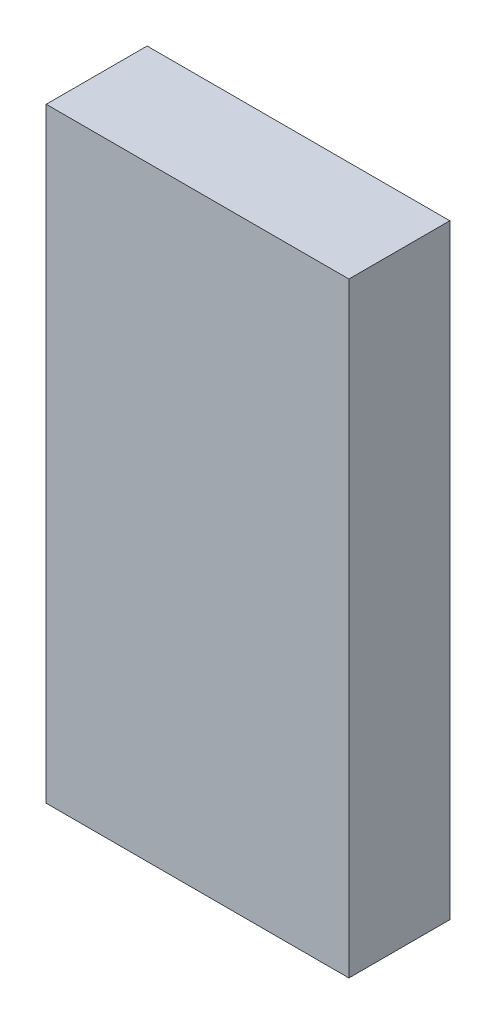
ISO-10303-21;
HEADER;
FILE_DESCRIPTION(('STEP AP214'),'2;1');
FILE_NAME('part.step','',(''),(''),'','','');
FILE_SCHEMA(('AUTOMOTIVE_DESIGN { 1 0 10303 214 1 1 1 1 }'));
ENDSEC;
DATA;
#1=APPLICATION_CONTEXT('core data for automotive mechanical design processes');
#2=APPLICATION_PROTOCOL_DEFINITION('international standard','automotive_design',2000,#1);
#3=PRODUCT_CONTEXT('',#1,'mechanical');
#4=PRODUCT('Part','Part','',(#3));
#5=PRODUCT_RELATED_PRODUCT_CATEGORY('part','',(#4));
#6=PRODUCT_DEFINITION_FORMATION('','',#4);
#7=PRODUCT_DEFINITION_CONTEXT('part definition',#1,'design');
#8=PRODUCT_DEFINITION('design','',#6,#7);
#9=PRODUCT_DEFINITION_SHAPE('','',#8);
#10=(LENGTH_UNIT() NAMED_UNIT(*) SI_UNIT(.MILLI.,.METRE.));
#11=(NAMED_UNIT(*) PLANE_ANGLE_UNIT() SI_UNIT($,.RADIAN.));
#12=(NAMED_UNIT(*) SI_UNIT($,.STERADIAN.) SOLID_ANGLE_UNIT());
#13=UNCERTAINTY_MEASURE_WITH_UNIT(LENGTH_MEASURE(1.E-05),#10,'distance_accuracy_value','');
#14=(GEOMETRIC_REPRESENTATION_CONTEXT(3) GLOBAL_UNCERTAINTY_ASSIGNED_CONTEXT((#13)) GLOBAL_UNIT_ASSIGNED_CONTEXT((#10,
#11,#12)) REPRESENTATION_CONTEXT('',''));
#15=CARTESIAN_POINT('',(0.,0.,0.));
#16=DIRECTION('',(0.,0.,1.));
#17=DIRECTION('',(1.,0.,0.));
#18=AXIS2_PLACEMENT_3D('',#15,#16,#17);
#19=CARTESIAN_POINT('',(3.,6.,2.));
#20=DIRECTION('',(-1.,0.,0.));
#21=DIRECTION('',(0.,-1.,0.));
#22=AXIS2_PLACEMENT_3D('',#19,#20,#21);
#23=PLANE('',#22);
#24=DIRECTION('',(0.,1.,0.));
#25=VECTOR('',#24,1.);
#26=CARTESIAN_POINT('',(3.,6.,0.));
#27=LINE('',#26,#25);
#28=CARTESIAN_POINT('',(3.,-6.,0.));
#29=VERTEX_POINT('',#28);
#30=CARTESIAN_POINT('',(3.,6.,0.));
#31=VERTEX_POINT('',#30);
#32=EDGE_CURVE('E104',#29,#31,#27,.T.);
#33=ORIENTED_EDGE('',*,*,#32,.T.);
#34=DIRECTION('',(0.,0.,-1.));
#35=VECTOR('',#34,1.);
#36=CARTESIAN_POINT('',(3.,6.,2.));
#37=LINE('',#36,#35);
#38=CARTESIAN_POINT('',(3.,6.,2.));
#39=VERTEX_POINT('',#38);
#40=EDGE_CURVE('E11',#39,#31,#37,.T.);
#41=ORIENTED_EDGE('',*,*,#40,.F.);
#42=DIRECTION('',(0.,1.,0.));
#43=VECTOR('',#42,1.);
#44=CARTESIAN_POINT('',(3.,6.,2.));
#45=LINE('',#44,#43);
#46=CARTESIAN_POINT('',(3.,-6.,2.));
#47=VERTEX_POINT('',#46);
#48=EDGE_CURVE('E87',#47,#39,#45,.T.);
#49=ORIENTED_EDGE('',*,*,#48,.F.);
#50=DIRECTION('',(0.,0.,-1.));
#51=VECTOR('',#50,1.);
#52=CARTESIAN_POINT('',(3.,-6.,2.));
#53=LINE('',#52,#51);
#54=EDGE_CURVE('E100',#47,#29,#53,.T.);
#55=ORIENTED_EDGE('',*,*,#54,.T.);
#56=EDGE_LOOP('',(#33,#41,#49,#55));
#57=FACE_BOUND('',#56,.T.);
#58=ADVANCED_FACE('F36',(#57),#23,.F.);
#59=CARTESIAN_POINT('',(-3.,6.,2.));
#60=DIRECTION('',(0.,-1.,0.));
#61=DIRECTION('',(0.,0.,-1.));
#62=AXIS2_PLACEMENT_3D('',#59,#60,#61);
#63=PLANE('',#62);
#64=DIRECTION('',(-1.,0.,0.));
#65=VECTOR('',#64,1.);
#66=CARTESIAN_POINT('',(-3.,6.,0.));
#67=LINE('',#66,#65);
#68=CARTESIAN_POINT('',(-3.,6.,0.));
#69=VERTEX_POINT('',#68);
#70=EDGE_CURVE('E91',#31,#69,#67,.T.);
#71=ORIENTED_EDGE('',*,*,#70,.T.);
#72=DIRECTION('',(0.,0.,-1.));
#73=VECTOR('',#72,1.);
#74=CARTESIAN_POINT('',(-3.,6.,2.));
#75=LINE('',#74,#73);
#76=CARTESIAN_POINT('',(-3.,6.,2.));
#77=VERTEX_POINT('',#76);
#78=EDGE_CURVE('E44',#77,#69,#75,.T.);
#79=ORIENTED_EDGE('',*,*,#78,.F.);
#80=DIRECTION('',(-1.,0.,0.));
#81=VECTOR('',#80,1.);
#82=CARTESIAN_POINT('',(-3.,6.,2.));
#83=LINE('',#82,#81);
#84=EDGE_CURVE('E82',#39,#77,#83,.T.);
#85=ORIENTED_EDGE('',*,*,#84,.F.);
#86=ORIENTED_EDGE('',*,*,#40,.T.);
#87=EDGE_LOOP('',(#71,#79,#85,#86));
#88=FACE_BOUND('',#87,.T.);
#89=ADVANCED_FACE('F90',(#88),#63,.F.);
#90=CARTESIAN_POINT('',(-3.,6.,2.));
#91=DIRECTION('',(1.,0.,0.));
#92=DIRECTION('',(0.,1.,0.));
#93=AXIS2_PLACEMENT_3D('',#90,#91,#92);
#94=PLANE('',#93);
#95=DIRECTION('',(0.,-1.,0.));
#96=VECTOR('',#95,1.);
#97=CARTESIAN_POINT('',(-3.,6.,0.));
#98=LINE('',#97,#96);
#99=CARTESIAN_POINT('',(-3.,-6.,0.));
#100=VERTEX_POINT('',#99);
#101=EDGE_CURVE('E69',#69,#100,#98,.T.);
#102=ORIENTED_EDGE('',*,*,#101,.T.);
#103=DIRECTION('',(0.,0.,-1.));
#104=VECTOR('',#103,1.);
#105=CARTESIAN_POINT('',(-3.,-6.,2.));
#106=LINE('',#105,#104);
#107=CARTESIAN_POINT('',(-3.,-6.,2.));
#108=VERTEX_POINT('',#107);
#109=EDGE_CURVE('E92',#108,#100,#106,.T.);
#110=ORIENTED_EDGE('',*,*,#109,.F.);
#111=DIRECTION('',(0.,-1.,0.));
#112=VECTOR('',#111,1.);
#113=CARTESIAN_POINT('',(-3.,6.,2.));
#114=LINE('',#113,#112);
#115=EDGE_CURVE('E85',#77,#108,#114,.T.);
#116=ORIENTED_EDGE('',*,*,#115,.F.);
#117=ORIENTED_EDGE('',*,*,#78,.T.);
#118=EDGE_LOOP('',(#102,#110,#116,#117));
#119=FACE_BOUND('',#118,.T.);
#120=ADVANCED_FACE('F93',(#119),#94,.F.);
#121=CARTESIAN_POINT('',(-3.,-6.,2.));
#122=DIRECTION('',(0.,1.,0.));
#123=DIRECTION('',(0.,0.,1.));
#124=AXIS2_PLACEMENT_3D('',#121,#122,#123);
#125=PLANE('',#124);
#126=DIRECTION('',(1.,0.,0.));
#127=VECTOR('',#126,1.);
#128=CARTESIAN_POINT('',(-3.,-6.,0.));
#129=LINE('',#128,#127);
#130=EDGE_CURVE('E75',#100,#29,#129,.T.);
#131=ORIENTED_EDGE('',*,*,#130,.T.);
#132=ORIENTED_EDGE('',*,*,#54,.F.);
#133=DIRECTION('',(1.,0.,0.));
#134=VECTOR('',#133,1.);
#135=CARTESIAN_POINT('',(-3.,-6.,2.));
#136=LINE('',#135,#134);
#137=EDGE_CURVE('E52',#108,#47,#136,.T.);
#138=ORIENTED_EDGE('',*,*,#137,.F.);
#139=ORIENTED_EDGE('',*,*,#109,.T.);
#140=EDGE_LOOP('',(#131,#132,#138,#139));
#141=FACE_BOUND('',#140,.T.);
#142=ADVANCED_FACE('F111',(#141),#125,.F.);
#143=CARTESIAN_POINT('',(0.,0.,2.));
#144=DIRECTION('',(0.,0.,1.));
#145=DIRECTION('',(1.,0.,0.));
#146=AXIS2_PLACEMENT_3D('',#143,#144,#145);
#147=PLANE('',#146);
#148=ORIENTED_EDGE('',*,*,#48,.T.);
#149=ORIENTED_EDGE('',*,*,#84,.T.);
#150=ORIENTED_EDGE('',*,*,#115,.T.);
#151=ORIENTED_EDGE('',*,*,#137,.T.);
#152=EDGE_LOOP('',(#148,#149,#150,#151));
#153=FACE_BOUND('',#152,.T.);
#154=ADVANCED_FACE('F83',(#153),#147,.T.);
#155=CARTESIAN_POINT('',(0.,0.,0.));
#156=DIRECTION('',(0.,0.,1.));
#157=DIRECTION('',(1.,0.,0.));
#158=AXIS2_PLACEMENT_3D('',#155,#156,#157);
#159=PLANE('',#158);
#160=ORIENTED_EDGE('',*,*,#32,.F.);
#161=ORIENTED_EDGE('',*,*,#130,.F.);
#162=ORIENTED_EDGE('',*,*,#101,.F.);
#163=ORIENTED_EDGE('',*,*,#70,.F.);
#164=EDGE_LOOP('',(#160,#161,#162,#163));
#165=FACE_BOUND('',#164,.T.);
#166=ADVANCED_FACE('F114',(#165),#159,.F.);
#167=CLOSED_SHELL('',(#58,#89,#120,#142,#154,#166));
#168=MANIFOLD_SOLID_BREP('B2',#167);
#169=ADVANCED_BREP_SHAPE_REPRESENTATION('',(#18,#168),#14);
#170=SHAPE_DEFINITION_REPRESENTATION(#9,#169);
ENDSEC;
END-ISO-10303-21;
